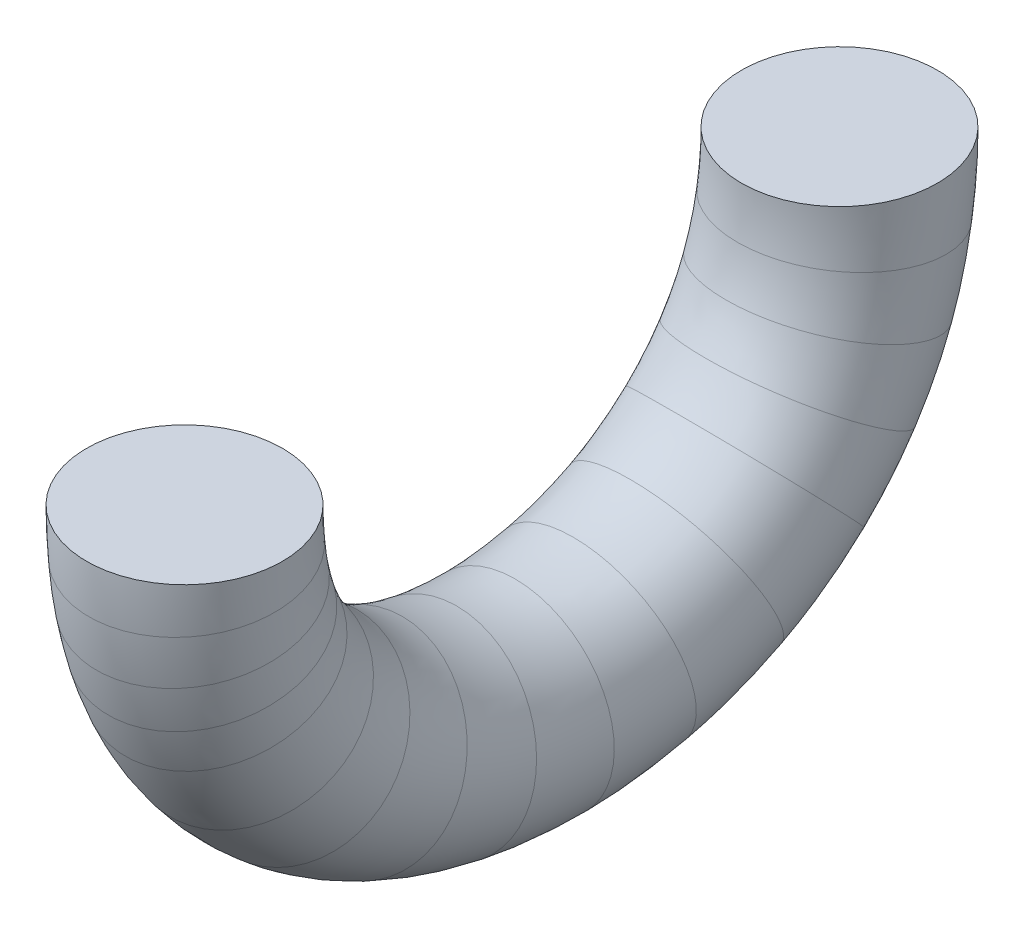
ISO-10303-21;
HEADER;
FILE_DESCRIPTION(('STEP AP214'),'2;1');
FILE_NAME('part.step','',(''),(''),'','','');
FILE_SCHEMA(('AUTOMOTIVE_DESIGN { 1 0 10303 214 1 1 1 1 }'));
ENDSEC;
DATA;
#1=APPLICATION_CONTEXT('core data for automotive mechanical design processes');
#2=APPLICATION_PROTOCOL_DEFINITION('international standard','automotive_design',2000,#1);
#3=PRODUCT_CONTEXT('',#1,'mechanical');
#4=PRODUCT('Part','Part','',(#3));
#5=PRODUCT_RELATED_PRODUCT_CATEGORY('part','',(#4));
#6=PRODUCT_DEFINITION_FORMATION('','',#4);
#7=PRODUCT_DEFINITION_CONTEXT('part definition',#1,'design');
#8=PRODUCT_DEFINITION('design','',#6,#7);
#9=PRODUCT_DEFINITION_SHAPE('','',#8);
#10=(LENGTH_UNIT() NAMED_UNIT(*) SI_UNIT(.MILLI.,.METRE.));
#11=(NAMED_UNIT(*) PLANE_ANGLE_UNIT() SI_UNIT($,.RADIAN.));
#12=(NAMED_UNIT(*) SI_UNIT($,.STERADIAN.) SOLID_ANGLE_UNIT());
#13=UNCERTAINTY_MEASURE_WITH_UNIT(LENGTH_MEASURE(1.E-05),#10,'distance_accuracy_value','');
#14=(GEOMETRIC_REPRESENTATION_CONTEXT(3) GLOBAL_UNCERTAINTY_ASSIGNED_CONTEXT((#13)) GLOBAL_UNIT_ASSIGNED_CONTEXT((#10,
#11,#12)) REPRESENTATION_CONTEXT('',''));
#15=CARTESIAN_POINT('',(0.,0.,0.));
#16=DIRECTION('',(0.,0.,1.));
#17=DIRECTION('',(1.,0.,0.));
#18=AXIS2_PLACEMENT_3D('',#15,#16,#17);
#19=CARTESIAN_POINT('',(-4.25000000000186,-227.95,247.824757540876));
#20=DIRECTION('',(0.,-1.,0.));
#21=DIRECTION('',(-1.,0.,0.));
#22=AXIS2_PLACEMENT_3D('',#19,#20,#21);
#23=PLANE('',#22);
#24=CARTESIAN_POINT('',(-4.25000000000186,-227.95,247.824757540876));
#25=DIRECTION('',(0.,-1.,0.));
#26=DIRECTION('',(0.,0.,1.));
#27=AXIS2_PLACEMENT_3D('',#24,#25,#26);
#28=CIRCLE('',#27,1.75);
#29=CARTESIAN_POINT('',(-4.25000000000186,-227.95,249.574757540876));
#30=VERTEX_POINT('',#29);
#31=EDGE_CURVE('E11',#30,#30,#28,.T.);
#32=ORIENTED_EDGE('',*,*,#31,.F.);
#33=EDGE_LOOP('',(#32));
#34=FACE_BOUND('',#33,.T.);
#35=ADVANCED_FACE('F43',(#34),#23,.F.);
#36=CARTESIAN_POINT('',(-4.25000000000181,-227.95,259.524757540733));
#37=DIRECTION('',(0.,1.,-1.38847267017184E-13));
#38=DIRECTION('',(0.,-1.38847267017184E-13,-1.));
#39=AXIS2_PLACEMENT_3D('',#36,#37,#38);
#40=PLANE('',#39);
#41=CARTESIAN_POINT('',(-4.25000000000181,-227.95,259.524757540733));
#42=DIRECTION('',(0.,1.,-1.42742960308951E-13));
#43=DIRECTION('',(0.,-1.42742960308951E-13,-1.));
#44=AXIS2_PLACEMENT_3D('',#41,#42,#43);
#45=CIRCLE('',#44,1.75);
#46=CARTESIAN_POINT('',(-4.25000000000183,-227.95,257.774757540733));
#47=VERTEX_POINT('',#46);
#48=EDGE_CURVE('E129',#47,#47,#45,.T.);
#49=ORIENTED_EDGE('',*,*,#48,.T.);
#50=EDGE_LOOP('',(#49));
#51=FACE_BOUND('',#50,.T.);
#52=ADVANCED_FACE('F160',(#51),#40,.T.);
#53=CARTESIAN_POINT('',(-4.25000000000179,-227.95,255.118105993326));
#54=DIRECTION('',(1.,0.,0.));
#55=DIRECTION('',(0.,0.,-1.));
#56=AXIS2_PLACEMENT_3D('',#53,#54,#55);
#57=TOROIDAL_SURFACE('',#56,7.29334845245024,1.75);
#58=ORIENTED_EDGE('',*,*,#31,.T.);
#59=EDGE_LOOP('',(#58));
#60=FACE_BOUND('',#59,.T.);
#61=CARTESIAN_POINT('',(-4.25000000000186,-229.108191111719,247.917305690749));
#62=DIRECTION('',(0.,-0.987310609046535,0.158801011533808));
#63=DIRECTION('',(0.,0.158801011533808,0.987310609046535));
#64=AXIS2_PLACEMENT_3D('',#61,#62,#63);
#65=CIRCLE('',#64,1.75);
#66=CARTESIAN_POINT('',(-4.25000000000186,-228.830289341535,249.64509925658));
#67=VERTEX_POINT('',#66);
#68=EDGE_CURVE('E53',#67,#67,#65,.T.);
#69=ORIENTED_EDGE('',*,*,#68,.F.);
#70=EDGE_LOOP('',(#69));
#71=FACE_BOUND('',#70,.T.);
#72=ADVANCED_FACE('F167',(#60,#71),#57,.T.);
#73=CARTESIAN_POINT('',(-4.25000000000181,-228.178649593999,253.69652707688));
#74=DIRECTION('',(-1.,0.,0.));
#75=DIRECTION('',(0.,0.,1.));
#76=AXIS2_PLACEMENT_3D('',#73,#74,#75);
#77=TOROIDAL_SURFACE('',#76,5.85349871983259,1.75);
#78=CARTESIAN_POINT('',(-4.25000000000186,-230.229443359348,248.214037478615));
#79=DIRECTION('',(0.,-0.93661754459586,0.350353500275395));
#80=DIRECTION('',(0.,0.350353500275395,0.93661754459586));
#81=AXIS2_PLACEMENT_3D('',#78,#79,#80);
#82=CIRCLE('',#81,1.75);
#83=CARTESIAN_POINT('',(-4.25000000000186,-229.616324733867,249.853118181658));
#84=VERTEX_POINT('',#83);
#85=EDGE_CURVE('E109',#84,#84,#82,.T.);
#86=ORIENTED_EDGE('',*,*,#85,.F.);
#87=EDGE_LOOP('',(#86));
#88=FACE_BOUND('',#87,.T.);
#89=ORIENTED_EDGE('',*,*,#68,.T.);
#90=EDGE_LOOP('',(#89));
#91=FACE_BOUND('',#90,.T.);
#92=ADVANCED_FACE('F185',(#88,#91),#77,.T.);
#93=CARTESIAN_POINT('',(-4.25000000000182,-228.33344690778,253.282699671612));
#94=DIRECTION('',(-1.,0.,0.));
#95=DIRECTION('',(0.,0.,1.));
#96=AXIS2_PLACEMENT_3D('',#93,#94,#95);
#97=TOROIDAL_SURFACE('',#96,5.41166693090729,1.75);
#98=CARTESIAN_POINT('',(-4.25000000000186,-231.293017524186,248.752017522356));
#99=DIRECTION('',(0.,-0.837206392614559,0.546887059789603));
#100=DIRECTION('',(0.,0.546887059789603,0.837206392614559));
#101=AXIS2_PLACEMENT_3D('',#98,#99,#100);
#102=CIRCLE('',#101,1.75);
#103=CARTESIAN_POINT('',(-4.25000000000186,-230.335965169554,250.217128709431));
#104=VERTEX_POINT('',#103);
#105=EDGE_CURVE('E112',#104,#104,#102,.T.);
#106=ORIENTED_EDGE('',*,*,#105,.F.);
#107=EDGE_LOOP('',(#106));
#108=FACE_BOUND('',#107,.T.);
#109=ORIENTED_EDGE('',*,*,#85,.T.);
#110=EDGE_LOOP('',(#109));
#111=FACE_BOUND('',#110,.T.);
#112=ADVANCED_FACE('F110',(#108,#111),#97,.T.);
#113=CARTESIAN_POINT('',(-4.25000000000182,-228.451158303547,253.10250024788));
#114=DIRECTION('',(-1.,0.,0.));
#115=DIRECTION('',(0.,0.,1.));
#116=AXIS2_PLACEMENT_3D('',#113,#114,#115);
#117=TOROIDAL_SURFACE('',#116,5.19642798227851,1.75);
#118=CARTESIAN_POINT('',(-4.25000000000185,-232.20911617274,249.513542679396));
#119=DIRECTION('',(0.,-0.690658579455879,0.723180977780795));
#120=DIRECTION('',(0.,0.723180977780795,0.690658579455879));
#121=AXIS2_PLACEMENT_3D('',#118,#119,#120);
#122=CIRCLE('',#121,1.75);
#123=CARTESIAN_POINT('',(-4.25000000000185,-230.943549461624,250.722195193443));
#124=VERTEX_POINT('',#123);
#125=EDGE_CURVE('E114',#124,#124,#122,.T.);
#126=ORIENTED_EDGE('',*,*,#125,.F.);
#127=EDGE_LOOP('',(#126));
#128=FACE_BOUND('',#127,.T.);
#129=ORIENTED_EDGE('',*,*,#105,.T.);
#130=EDGE_LOOP('',(#129));
#131=FACE_BOUND('',#130,.T.);
#132=ADVANCED_FACE('F184',(#128,#131),#117,.T.);
#133=CARTESIAN_POINT('',(-4.25000000000185,-228.294185097982,253.252414162239));
#134=DIRECTION('',(-1.,0.,0.));
#135=DIRECTION('',(0.,0.,1.));
#136=AXIS2_PLACEMENT_3D('',#133,#134,#135);
#137=TOROIDAL_SURFACE('',#136,5.41348734969734,1.75);
#138=CARTESIAN_POINT('',(-4.25000000000184,-233.094178822233,250.74923507706));
#139=DIRECTION('',(0.,-0.462396773739602,0.886673121074056));
#140=DIRECTION('',(0.,0.886673121074056,0.462396773739602));
#141=AXIS2_PLACEMENT_3D('',#138,#139,#140);
#142=CIRCLE('',#141,1.75);
#143=CARTESIAN_POINT('',(-4.25000000000185,-231.542500860353,251.558429431104));
#144=VERTEX_POINT('',#143);
#145=EDGE_CURVE('E124',#144,#144,#142,.T.);
#146=ORIENTED_EDGE('',*,*,#145,.F.);
#147=EDGE_LOOP('',(#146));
#148=FACE_BOUND('',#147,.T.);
#149=ORIENTED_EDGE('',*,*,#125,.T.);
#150=EDGE_LOOP('',(#149));
#151=FACE_BOUND('',#150,.T.);
#152=ADVANCED_FACE('F181',(#148,#151),#137,.T.);
#153=CARTESIAN_POINT('',(-4.25000000000182,-227.634654242553,253.59635707929));
#154=DIRECTION('',(-1.,0.,0.));
#155=DIRECTION('',(0.,0.,1.));
#156=AXIS2_PLACEMENT_3D('',#153,#154,#155);
#157=TOROIDAL_SURFACE('',#156,6.15731372692062,1.75);
#158=CARTESIAN_POINT('',(-4.25000000000184,-233.626078652336,252.176728299092));
#159=DIRECTION('',(0.,-0.230559760824183,0.973058167166124));
#160=DIRECTION('',(0.,0.973058167166124,0.230559760824183));
#161=AXIS2_PLACEMENT_3D('',#158,#159,#160);
#162=CIRCLE('',#161,1.75);
#163=CARTESIAN_POINT('',(-4.25000000000185,-231.923226859796,252.580207880534));
#164=VERTEX_POINT('',#163);
#165=EDGE_CURVE('E133',#164,#164,#162,.T.);
#166=ORIENTED_EDGE('',*,*,#165,.F.);
#167=EDGE_LOOP('',(#166));
#168=FACE_BOUND('',#167,.T.);
#169=ORIENTED_EDGE('',*,*,#145,.T.);
#170=EDGE_LOOP('',(#169));
#171=FACE_BOUND('',#170,.T.);
#172=ADVANCED_FACE('F179',(#168,#171),#157,.T.);
#173=CARTESIAN_POINT('',(-4.2500000000018,-227.312034807198,253.672799641884));
#174=DIRECTION('',(-1.,0.,0.));
#175=DIRECTION('',(0.,1.,0.));
#176=AXIS2_PLACEMENT_3D('',#173,#174,#175);
#177=TOROIDAL_SURFACE('',#176,6.48886578232723,1.75);
#178=CARTESIAN_POINT('',(-4.25000000000184,-233.800465729658,253.597677704167));
#179=DIRECTION('',(0.,-0.0115770521749792,0.999932983685876));
#180=DIRECTION('',(0.,0.999932983685876,0.0115770521749792));
#181=AXIS2_PLACEMENT_3D('',#178,#179,#180);
#182=CIRCLE('',#181,1.75);
#183=CARTESIAN_POINT('',(-4.25000000000184,-232.050583008207,253.617937545473));
#184=VERTEX_POINT('',#183);
#185=EDGE_CURVE('E47',#184,#184,#182,.T.);
#186=ORIENTED_EDGE('',*,*,#185,.F.);
#187=EDGE_LOOP('',(#186));
#188=FACE_BOUND('',#187,.T.);
#189=ORIENTED_EDGE('',*,*,#165,.T.);
#190=EDGE_LOOP('',(#189));
#191=FACE_BOUND('',#190,.T.);
#192=ADVANCED_FACE('F170',(#188,#191),#177,.T.);
#193=CARTESIAN_POINT('',(-4.25000000000187,-227.280090504122,253.673169487533));
#194=DIRECTION('',(-1.,0.,0.));
#195=DIRECTION('',(0.,1.,0.));
#196=AXIS2_PLACEMENT_3D('',#193,#194,#195);
#197=TOROIDAL_SURFACE('',#196,6.52081222633542,1.75);
#198=CARTESIAN_POINT('',(-4.25000000000183,-233.659780916872,255.022444229238));
#199=DIRECTION('',(0.,0.206918202038427,0.978358246076142));
#200=DIRECTION('',(0.,0.978358246076142,-0.206918202038427));
#201=AXIS2_PLACEMENT_3D('',#198,#199,#200);
#202=CIRCLE('',#201,1.75);
#203=CARTESIAN_POINT('',(-4.25000000000183,-231.947653986239,254.66033737567));
#204=VERTEX_POINT('',#203);
#205=EDGE_CURVE('E125',#204,#204,#202,.T.);
#206=ORIENTED_EDGE('',*,*,#205,.F.);
#207=EDGE_LOOP('',(#206));
#208=FACE_BOUND('',#207,.T.);
#209=ORIENTED_EDGE('',*,*,#185,.T.);
#210=EDGE_LOOP('',(#209));
#211=FACE_BOUND('',#210,.T.);
#212=ADVANCED_FACE('F210',(#208,#211),#197,.T.);
#213=CARTESIAN_POINT('',(-4.25000000000183,-227.56421362334,253.733260200954));
#214=DIRECTION('',(-1.,0.,0.));
#215=DIRECTION('',(0.,0.,1.));
#216=AXIS2_PLACEMENT_3D('',#213,#214,#215);
#217=TOROIDAL_SURFACE('',#216,6.23040416736797,1.75);
#218=CARTESIAN_POINT('',(-4.25000000000182,-233.206439075569,256.375840007691));
#219=DIRECTION('',(0.,0.424142597454172,0.905595415748571));
#220=DIRECTION('',(0.,0.905595415748571,-0.424142597454172));
#221=AXIS2_PLACEMENT_3D('',#218,#219,#220);
#222=CIRCLE('',#221,1.75);
#223=CARTESIAN_POINT('',(-4.25000000000183,-231.621647098009,255.633590462146));
#224=VERTEX_POINT('',#223);
#225=EDGE_CURVE('E120',#224,#224,#222,.T.);
#226=ORIENTED_EDGE('',*,*,#225,.F.);
#227=EDGE_LOOP('',(#226));
#228=FACE_BOUND('',#227,.T.);
#229=ORIENTED_EDGE('',*,*,#205,.T.);
#230=EDGE_LOOP('',(#229));
#231=FACE_BOUND('',#230,.T.);
#232=ADVANCED_FACE('F177',(#228,#231),#217,.T.);
#233=CARTESIAN_POINT('',(-4.25000000000182,-228.212476745901,254.036879234194));
#234=DIRECTION('',(-1.,0.,0.));
#235=DIRECTION('',(0.,0.,1.));
#236=AXIS2_PLACEMENT_3D('',#233,#234,#235);
#237=TOROIDAL_SURFACE('',#236,5.51456228998273,1.75);
#238=CARTESIAN_POINT('',(-4.25000000000182,-232.440547639389,257.577191899727));
#239=DIRECTION('',(0.,0.641993412961339,0.766710152348495));
#240=DIRECTION('',(0.,0.766710152348495,-0.641993412961339));
#241=AXIS2_PLACEMENT_3D('',#238,#239,#240);
#242=CIRCLE('',#241,1.75);
#243=CARTESIAN_POINT('',(-4.25000000000183,-231.098804872779,256.453703427045));
#244=VERTEX_POINT('',#243);
#245=EDGE_CURVE('E117',#244,#244,#242,.T.);
#246=ORIENTED_EDGE('',*,*,#245,.F.);
#247=EDGE_LOOP('',(#246));
#248=FACE_BOUND('',#247,.T.);
#249=ORIENTED_EDGE('',*,*,#225,.T.);
#250=EDGE_LOOP('',(#249));
#251=FACE_BOUND('',#250,.T.);
#252=ADVANCED_FACE('F173',(#248,#251),#237,.T.);
#253=CARTESIAN_POINT('',(-4.25000000000182,-228.417999803245,254.208970928326));
#254=DIRECTION('',(-1.,0.,0.));
#255=DIRECTION('',(0.,1.,0.));
#256=AXIS2_PLACEMENT_3D('',#253,#254,#255);
#257=TOROIDAL_SURFACE('',#256,5.24650394131782,1.75);
#258=CARTESIAN_POINT('',(-4.25000000000182,-231.59297956148,258.385728898457));
#259=DIRECTION('',(0.,0.79610308442507,0.605161035567302));
#260=DIRECTION('',(0.,0.605161035567302,-0.79610308442507));
#261=AXIS2_PLACEMENT_3D('',#258,#259,#260);
#262=CIRCLE('',#261,1.75);
#263=CARTESIAN_POINT('',(-4.25000000000183,-230.533947749237,256.992548500714));
#264=VERTEX_POINT('',#263);
#265=EDGE_CURVE('E121',#264,#264,#262,.T.);
#266=ORIENTED_EDGE('',*,*,#265,.F.);
#267=EDGE_LOOP('',(#266));
#268=FACE_BOUND('',#267,.T.);
#269=ORIENTED_EDGE('',*,*,#245,.T.);
#270=EDGE_LOOP('',(#269));
#271=FACE_BOUND('',#270,.T.);
#272=ADVANCED_FACE('F176',(#268,#271),#257,.T.);
#273=CARTESIAN_POINT('',(-4.25000000000185,-228.391028080532,254.17348901462));
#274=DIRECTION('',(-1.,0.,0.));
#275=DIRECTION('',(0.,0.,1.));
#276=AXIS2_PLACEMENT_3D('',#273,#274,#275);
#277=TOROIDAL_SURFACE('',#276,5.29107343790761,1.75);
#278=CARTESIAN_POINT('',(-4.25000000000181,-230.587601776468,258.987065868027));
#279=DIRECTION('',(0.,0.909754307872747,0.41514708153494));
#280=DIRECTION('',(0.,0.41514708153494,-0.909754307872747));
#281=AXIS2_PLACEMENT_3D('',#278,#279,#280);
#282=CIRCLE('',#281,1.75);
#283=CARTESIAN_POINT('',(-4.25000000000183,-229.861094383782,257.39499582925));
#284=VERTEX_POINT('',#283);
#285=EDGE_CURVE('E100',#284,#284,#282,.T.);
#286=ORIENTED_EDGE('',*,*,#285,.F.);
#287=EDGE_LOOP('',(#286));
#288=FACE_BOUND('',#287,.T.);
#289=ORIENTED_EDGE('',*,*,#265,.T.);
#290=EDGE_LOOP('',(#289));
#291=FACE_BOUND('',#290,.T.);
#292=ADVANCED_FACE('F155',(#288,#291),#277,.T.);
#293=CARTESIAN_POINT('',(-4.25000000000194,-228.291316314669,253.954980412313));
#294=DIRECTION('',(-1.,0.,0.));
#295=DIRECTION('',(0.,0.,1.));
#296=AXIS2_PLACEMENT_3D('',#293,#294,#295);
#297=TOROIDAL_SURFACE('',#296,5.53125762875694,1.75);
#298=CARTESIAN_POINT('',(-4.25000000000181,-229.988373692892,259.219465877266));
#299=DIRECTION('',(0.,0.951770070803389,0.306812210192017));
#300=DIRECTION('',(0.,0.306812210192017,-0.951770070803389));
#301=AXIS2_PLACEMENT_3D('',#298,#299,#300);
#302=CIRCLE('',#301,1.75);
#303=CARTESIAN_POINT('',(-4.25000000000183,-229.451452325056,257.55386825336));
#304=VERTEX_POINT('',#303);
#305=EDGE_CURVE('E105',#304,#304,#302,.T.);
#306=ORIENTED_EDGE('',*,*,#305,.F.);
#307=EDGE_LOOP('',(#306));
#308=FACE_BOUND('',#307,.T.);
#309=ORIENTED_EDGE('',*,*,#285,.T.);
#310=EDGE_LOOP('',(#309));
#311=FACE_BOUND('',#310,.T.);
#312=ADVANCED_FACE('F149',(#308,#311),#297,.T.);
#313=CARTESIAN_POINT('',(-4.25000000000197,-228.128813683583,253.450876809001));
#314=DIRECTION('',(-1.,0.,0.));
#315=DIRECTION('',(0.,0.,1.));
#316=AXIS2_PLACEMENT_3D('',#313,#314,#315);
#317=TOROIDAL_SURFACE('',#316,6.06090614237936,1.75);
#318=CARTESIAN_POINT('',(-4.25000000000181,-229.366882877427,259.38398458975));
#319=DIRECTION('',(0.,0.978914314356902,0.204271302798889));
#320=DIRECTION('',(0.,0.204271302798889,-0.978914314356902));
#321=AXIS2_PLACEMENT_3D('',#318,#319,#320);
#322=CIRCLE('',#321,1.75);
#323=CARTESIAN_POINT('',(-4.25000000000183,-229.009408097529,257.670884539625));
#324=VERTEX_POINT('',#323);
#325=EDGE_CURVE('E127',#324,#324,#322,.T.);
#326=ORIENTED_EDGE('',*,*,#325,.F.);
#327=EDGE_LOOP('',(#326));
#328=FACE_BOUND('',#327,.T.);
#329=ORIENTED_EDGE('',*,*,#305,.T.);
#330=EDGE_LOOP('',(#329));
#331=FACE_BOUND('',#330,.T.);
#332=ADVANCED_FACE('F144',(#328,#331),#317,.T.);
#333=CARTESIAN_POINT('',(-4.25000000000167,-228.048657727814,253.066751327795));
#334=DIRECTION('',(-1.,0.,0.));
#335=DIRECTION('',(0.,0.,1.));
#336=AXIS2_PLACEMENT_3D('',#333,#334,#335);
#337=TOROIDAL_SURFACE('',#336,6.45330563595249,1.75);
#338=CARTESIAN_POINT('',(-4.25000000000181,-228.662204290266,259.490824354056));
#339=DIRECTION('',(0.,0.995470134014743,0.0950747720726636));
#340=DIRECTION('',(0.,0.0950747720726636,-0.995470134014743));
#341=AXIS2_PLACEMENT_3D('',#338,#339,#340);
#342=CIRCLE('',#341,1.75);
#343=CARTESIAN_POINT('',(-4.25000000000183,-228.495823439138,257.74875161953));
#344=VERTEX_POINT('',#343);
#345=EDGE_CURVE('E136',#344,#344,#342,.T.);
#346=ORIENTED_EDGE('',*,*,#345,.F.);
#347=EDGE_LOOP('',(#346));
#348=FACE_BOUND('',#347,.T.);
#349=ORIENTED_EDGE('',*,*,#325,.T.);
#350=EDGE_LOOP('',(#349));
#351=FACE_BOUND('',#350,.T.);
#352=ADVANCED_FACE('F141',(#348,#351),#337,.T.);
#353=CARTESIAN_POINT('',(-4.25000000000181,-227.95,252.033766242651));
#354=DIRECTION('',(-1.,0.,0.));
#355=DIRECTION('',(0.,0.,1.));
#356=AXIS2_PLACEMENT_3D('',#353,#354,#355);
#357=TOROIDAL_SURFACE('',#356,7.49099129808057,1.75);
#358=ORIENTED_EDGE('',*,*,#48,.F.);
#359=EDGE_LOOP('',(#358));
#360=FACE_BOUND('',#359,.T.);
#361=ORIENTED_EDGE('',*,*,#345,.T.);
#362=EDGE_LOOP('',(#361));
#363=FACE_BOUND('',#362,.T.);
#364=ADVANCED_FACE('F45',(#360,#363),#357,.T.);
#365=CLOSED_SHELL('',(#35,#52,#72,#92,#112,#132,#152,#172,#192,#212,#232,#252,#272,#292,#312,
#332,#352,#364));
#366=MANIFOLD_SOLID_BREP('B2',#365);
#367=ADVANCED_BREP_SHAPE_REPRESENTATION('',(#18,#366),#14);
#368=SHAPE_DEFINITION_REPRESENTATION(#9,#367);
ENDSEC;
END-ISO-10303-21;
